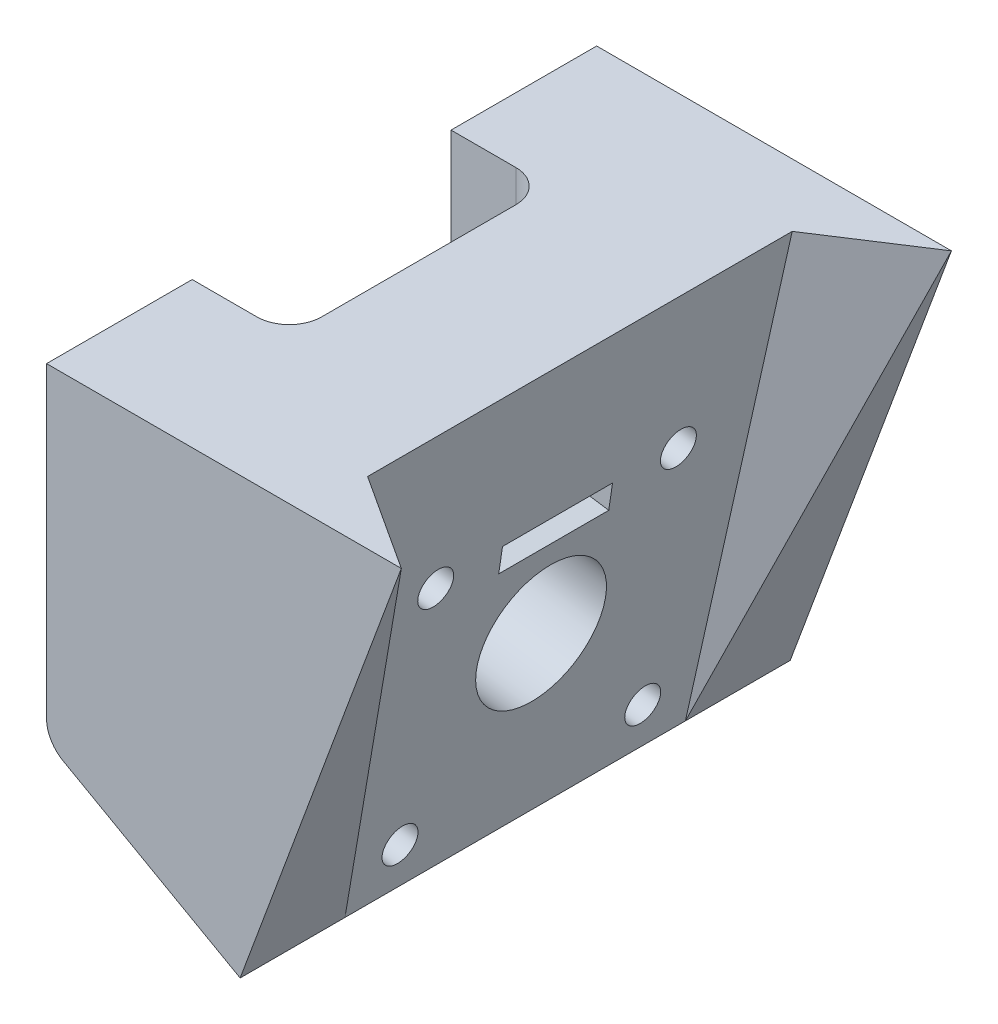
ISO-10303-21;
HEADER;
FILE_DESCRIPTION(('STEP AP214'),'2;1');
FILE_NAME('part.step','',(''),(''),'','','');
FILE_SCHEMA(('AUTOMOTIVE_DESIGN { 1 0 10303 214 1 1 1 1 }'));
ENDSEC;
DATA;
#1=APPLICATION_CONTEXT('core data for automotive mechanical design processes');
#2=APPLICATION_PROTOCOL_DEFINITION('international standard','automotive_design',2000,#1);
#3=PRODUCT_CONTEXT('',#1,'mechanical');
#4=PRODUCT('Part','Part','',(#3));
#5=PRODUCT_RELATED_PRODUCT_CATEGORY('part','',(#4));
#6=PRODUCT_DEFINITION_FORMATION('','',#4);
#7=PRODUCT_DEFINITION_CONTEXT('part definition',#1,'design');
#8=PRODUCT_DEFINITION('design','',#6,#7);
#9=PRODUCT_DEFINITION_SHAPE('','',#8);
#10=(LENGTH_UNIT() NAMED_UNIT(*) SI_UNIT(.MILLI.,.METRE.));
#11=(NAMED_UNIT(*) PLANE_ANGLE_UNIT() SI_UNIT($,.RADIAN.));
#12=(NAMED_UNIT(*) SI_UNIT($,.STERADIAN.) SOLID_ANGLE_UNIT());
#13=UNCERTAINTY_MEASURE_WITH_UNIT(LENGTH_MEASURE(1.E-05),#10,'distance_accuracy_value','');
#14=(GEOMETRIC_REPRESENTATION_CONTEXT(3) GLOBAL_UNCERTAINTY_ASSIGNED_CONTEXT((#13)) GLOBAL_UNIT_ASSIGNED_CONTEXT((#10,
#11,#12)) REPRESENTATION_CONTEXT('',''));
#15=CARTESIAN_POINT('',(0.,0.,0.));
#16=DIRECTION('',(0.,0.,1.));
#17=DIRECTION('',(1.,0.,0.));
#18=AXIS2_PLACEMENT_3D('',#15,#16,#17);
#19=CARTESIAN_POINT('',(117.270976535761,-67.4228474734763,16.9999999999979));
#20=DIRECTION('',(0.989128001977036,-0.147057117151522,0.));
#21=DIRECTION('',(0.,0.,-1.));
#22=AXIS2_PLACEMENT_3D('',#19,#20,#21);
#23=ELLIPSE('',#22,2.,1.97825600395407);
#24=DIRECTION('',(0.989128001977036,-0.147057117151522,0.));
#25=VECTOR('',#24,1.);
#26=SURFACE_OF_LINEAR_EXTRUSION('',#23,#25);
#27=CARTESIAN_POINT('',(117.620742166067,-67.4748483521984,14.9999999999979));
#28=CARTESIAN_POINT('',(117.620742166067,-67.5300800189186,14.9999977073727));
#29=CARTESIAN_POINT('',(117.620742166067,-67.5852960686657,15.0022843826991));
#30=CARTESIAN_POINT('',(117.620742166067,-67.7507481225265,15.0160337412086));
#31=CARTESIAN_POINT('',(117.620742166067,-67.8604978556769,15.0344096730208));
#32=CARTESIAN_POINT('',(117.620742166067,-68.0753802779435,15.0890653123963));
#33=CARTESIAN_POINT('',(117.620742166067,-68.1805129670598,15.1253450199597));
#34=CARTESIAN_POINT('',(117.620742166067,-68.3833407816303,15.2148056612309));
#35=CARTESIAN_POINT('',(117.620742166067,-68.4810359070844,15.2679865949387));
#36=CARTESIAN_POINT('',(117.620742166067,-68.6662728131402,15.3897833968307));
#37=CARTESIAN_POINT('',(117.620742166067,-68.7538145937419,15.4583992650149));
#38=CARTESIAN_POINT('',(117.620742166067,-68.9163359739532,15.6091732801807));
#39=CARTESIAN_POINT('',(117.620742166067,-68.9913155735629,15.6913314271623));
#40=CARTESIAN_POINT('',(117.620742166067,-69.126643029292,15.8669240033139));
#41=CARTESIAN_POINT('',(117.620742166067,-69.1869908854114,15.9603584324841));
#42=CARTESIAN_POINT('',(117.620742166067,-69.2913907864965,16.1559265147342));
#43=CARTESIAN_POINT('',(117.620742166067,-69.3354428314621,16.2580601678142));
#44=CARTESIAN_POINT('',(117.620742166067,-69.406035985642,16.4682097156529));
#45=CARTESIAN_POINT('',(117.620742166067,-69.4325770948562,16.5762256104116));
#46=CARTESIAN_POINT('',(117.620742166067,-69.4674163669998,16.7951604158238));
#47=CARTESIAN_POINT('',(117.620742166067,-69.4757145299291,16.9060793264774));
#48=CARTESIAN_POINT('',(117.620742166067,-69.4738390270468,17.1277608696691));
#49=CARTESIAN_POINT('',(117.620742166067,-69.4636653612352,17.2385235022073));
#50=CARTESIAN_POINT('',(117.620742166067,-69.4251268064956,17.4568375052808));
#51=CARTESIAN_POINT('',(117.620742166067,-69.3967619175675,17.5643888758162));
#52=CARTESIAN_POINT('',(117.620742166067,-69.3226232581912,17.7733139420283));
#53=CARTESIAN_POINT('',(117.620742166067,-69.276849487743,17.8746876377051));
#54=CARTESIAN_POINT('',(117.620742166067,-69.1691555682338,18.06846132999));
#55=CARTESIAN_POINT('',(117.620742166067,-69.1072354191728,18.1608613265981));
#56=CARTESIAN_POINT('',(117.620742166067,-68.9689565842048,18.3341391033477));
#57=CARTESIAN_POINT('',(117.620742166067,-68.8925978982978,18.4150168834893));
#58=CARTESIAN_POINT('',(117.620742166067,-68.7275480659121,18.563019508286));
#59=CARTESIAN_POINT('',(117.620742166067,-68.6388569194333,18.630144352941));
#60=CARTESIAN_POINT('',(117.620742166067,-68.4515883881759,18.7487897123842));
#61=CARTESIAN_POINT('',(117.620742166067,-68.3530110033974,18.8003102271722));
#62=CARTESIAN_POINT('',(117.620742166067,-68.1486888936954,18.8863259211112));
#63=CARTESIAN_POINT('',(117.620742166067,-68.0429441687721,18.9208211002622));
#64=CARTESIAN_POINT('',(117.620742166067,-67.8272039619101,18.9718346990368));
#65=CARTESIAN_POINT('',(117.620742166067,-67.7172084799714,18.9883531186604));
#66=CARTESIAN_POINT('',(117.620742166067,-67.4960005838601,19.0029575979327));
#67=CARTESIAN_POINT('',(117.620742166067,-67.3847881696874,19.0010436575814));
#68=CARTESIAN_POINT('',(117.620742166067,-67.1642137985331,18.9788362059782));
#69=CARTESIAN_POINT('',(117.620742166067,-67.0548518415516,18.9585426947262));
#70=CARTESIAN_POINT('',(117.620742166067,-66.8409947360819,18.9001358239234));
#71=CARTESIAN_POINT('',(117.620742166067,-66.7364995875938,18.8620224643727));
#72=CARTESIAN_POINT('',(117.620742166067,-66.5352582172261,18.7690271151919));
#73=CARTESIAN_POINT('',(117.620742166067,-66.4385119953465,18.7141451255619));
#74=CARTESIAN_POINT('',(117.620742166067,-66.2554368703883,18.5891262360346));
#75=CARTESIAN_POINT('',(117.620742166067,-66.1691079673096,18.5189893361371));
#76=CARTESIAN_POINT('',(117.620742166067,-66.0092485483546,18.3653950970291));
#77=CARTESIAN_POINT('',(117.620742166067,-65.9357180324782,18.2819377578186));
#78=CARTESIAN_POINT('',(117.620742166067,-65.8034834593923,18.1040045068489));
#79=CARTESIAN_POINT('',(117.620742166067,-65.7447794021828,18.0095285950898));
#80=CARTESIAN_POINT('',(117.620742166067,-65.6438168841618,17.8121639729725));
#81=CARTESIAN_POINT('',(117.620742166067,-65.6015584233504,17.7092752626143));
#82=CARTESIAN_POINT('',(117.620742166067,-65.5346526434757,17.4979228536995));
#83=CARTESIAN_POINT('',(117.620742166067,-65.5100053244124,17.3894591551429));
#84=CARTESIAN_POINT('',(117.620742166067,-65.4790016360317,17.1699483458289));
#85=CARTESIAN_POINT('',(117.620742166067,-65.4726452667141,17.0589012350717));
#86=CARTESIAN_POINT('',(117.620742166067,-65.4783987896626,16.8372864319267));
#87=CARTESIAN_POINT('',(117.620742166067,-65.4905086819287,16.726718739539));
#88=CARTESIAN_POINT('',(117.620742166067,-65.5328607411484,16.5091123786218));
#89=CARTESIAN_POINT('',(117.620742166067,-65.563102908102,16.4020737100924));
#90=CARTESIAN_POINT('',(117.620742166067,-65.6408853206015,16.1944776748413));
#91=CARTESIAN_POINT('',(117.620742166067,-65.6884255661473,16.0939203081196));
#92=CARTESIAN_POINT('',(117.620742166067,-65.7994931951437,15.9020603624718));
#93=CARTESIAN_POINT('',(117.620742166067,-65.8630205785943,15.8107577835457));
#94=CARTESIAN_POINT('',(117.620742166067,-66.0043092525386,15.6399257475498));
#95=CARTESIAN_POINT('',(117.620742166067,-66.0820705430322,15.56039629048));
#96=CARTESIAN_POINT('',(117.620742166067,-66.2496862225971,15.415303711664));
#97=CARTESIAN_POINT('',(117.620742166067,-66.3395406116683,15.3497405899179));
#98=CARTESIAN_POINT('',(117.620742166067,-66.5288494275008,15.2343901846421));
#99=CARTESIAN_POINT('',(117.620742166067,-66.6283038542621,15.1846029011125));
#100=CARTESIAN_POINT('',(117.620742166067,-66.8341247229826,15.102172958334));
#101=CARTESIAN_POINT('',(117.620742166067,-66.9404911649419,15.0695302990852));
#102=CARTESIAN_POINT('',(117.620742166067,-67.1187015917306,15.0306593088579));
#103=CARTESIAN_POINT('',(117.620742166067,-67.1894469998617,15.0191717566569));
#104=CARTESIAN_POINT('',(117.620742166067,-67.3317534211829,15.0038455997529));
#105=CARTESIAN_POINT('',(117.620742166067,-67.4033139851448,15.000002969336));
#106=CARTESIAN_POINT('',(117.620742166067,-67.4748483521984,14.9999999999979));
#107=B_SPLINE_CURVE_WITH_KNOTS('',3,(#27,#28,#29,#30,#31,#32,#33,#34,#35,#36,#37,#38,#39,#40,
#41,#42,#43,#44,#45,#46,#47,#48,#49,#50,#51,#52,#53,#54,#55,#56,#57,#58,#59,#60,#61,#62,#63,#64,
#65,#66,#67,#68,#69,#70,#71,#72,#73,#74,#75,#76,#77,#78,#79,#80,#81,#82,#83,#84,#85,#86,#87,#88,
#89,#90,#91,#92,#93,#94,#95,#96,#97,#98,#99,#100,#101,#102,#103,#104,#105,#106),.UNSPECIFIED.,
.T.,.F.,(4,2,2,2,2,2,2,2,2,2,2,2,2,2,2,2,2,2,2,2,2,2,2,2,2,2,2,2,2,2,2,2,2,2,2,2,2,2,2,4),(0.,
0.165644887748438,0.497797612508073,0.829950337267727,1.16210306202735,1.49425578678697,
1.82640851154659,2.15856123630621,2.49071396106583,2.82286668582546,3.15501941058508,
3.4871721353447,3.81932486010432,4.15147758486394,4.48363030962358,4.81578303438321,
5.14793575914283,5.48008848390246,5.81224120866207,6.14439393342171,6.47654665818134,
6.80869938294096,7.14085210770059,7.47300483246021,7.80515755721983,8.13731028197947,
8.46946300673909,8.8016157314987,9.13376845625833,9.46592118101795,9.79807390577758,
10.1302266305372,10.4623793552968,10.7945320800564,11.1266848048161,11.4588375295757,
11.7909902543353,12.1231429790949,12.3377942386327,12.5523324357283),.UNSPECIFIED.);
#108=CARTESIAN_POINT('',(117.620742166067,-67.4748483521984,14.9999999999979));
#109=VERTEX_POINT('',#108);
#110=EDGE_CURVE('E219',#109,#109,#107,.T.);
#111=ORIENTED_EDGE('',*,*,#110,.T.);
#112=EDGE_LOOP('',(#111));
#113=FACE_BOUND('',#112,.T.);
#114=CARTESIAN_POINT('',(120.238360541692,-67.8640188249308,16.9999999999979));
#115=DIRECTION('',(0.989128001977036,-0.147057117151522,0.));
#116=DIRECTION('',(0.,0.,-1.));
#117=AXIS2_PLACEMENT_3D('',#114,#115,#116);
#118=ELLIPSE('',#117,2.,1.97825600395407);
#119=CARTESIAN_POINT('',(120.238360541692,-67.8640188249308,14.9999999999979));
#120=VERTEX_POINT('',#119);
#121=EDGE_CURVE('E540',#120,#120,#118,.T.);
#122=ORIENTED_EDGE('',*,*,#121,.T.);
#123=EDGE_LOOP('',(#122));
#124=FACE_BOUND('',#123,.T.);
#125=ADVANCED_FACE('F44',(#113,#124),#26,.F.);
#126=CARTESIAN_POINT('',(133.548665218225,-52.4485867412738,0.));
#127=DIRECTION('',(-0.937762193643602,0.347278084786155,0.));
#128=DIRECTION('',(-0.347278084786155,-0.937762193643602,0.));
#129=AXIS2_PLACEMENT_3D('',#126,#127,#128);
#130=PLANE('',#129);
#131=DIRECTION('',(0.,0.,1.));
#132=VECTOR('',#131,1.);
#133=CARTESIAN_POINT('',(123.585184195802,-79.3531805789968,-3.60278250746475));
#134=LINE('',#133,#132);
#135=CARTESIAN_POINT('',(123.585184195802,-79.3531805789968,27.520310710116));
#136=VERTEX_POINT('',#135);
#137=CARTESIAN_POINT('',(123.585184195802,-79.3531805789968,34.));
#138=VERTEX_POINT('',#137);
#139=EDGE_CURVE('E462',#136,#138,#134,.T.);
#140=ORIENTED_EDGE('',*,*,#139,.F.);
#141=DIRECTION('',(0.338746099408536,0.914723097097162,0.220301465661212));
#142=VECTOR('',#141,1.);
#143=CARTESIAN_POINT('',(131.011372303877,-59.3000912660725,32.3498869837358));
#144=LINE('',#143,#142);
#145=CARTESIAN_POINT('',(133.548665218225,-52.4485867412738,34.));
#146=VERTEX_POINT('',#145);
#147=EDGE_CURVE('E447',#136,#146,#144,.T.);
#148=ORIENTED_EDGE('',*,*,#147,.T.);
#149=DIRECTION('',(-0.347278084786155,-0.937762193643602,0.));
#150=VECTOR('',#149,1.);
#151=CARTESIAN_POINT('',(133.548665218225,-52.4485867412738,34.));
#152=LINE('',#151,#150);
#153=EDGE_CURVE('E437',#146,#138,#152,.T.);
#154=ORIENTED_EDGE('',*,*,#153,.T.);
#155=EDGE_LOOP('',(#140,#148,#154));
#156=FACE_BOUND('',#155,.T.);
#157=ADVANCED_FACE('F237',(#156),#130,.F.);
#158=CARTESIAN_POINT('',(126.509316799064,-80.9969381931816,34.));
#159=DIRECTION('',(0.490019596809526,0.871711417123023,0.));
#160=DIRECTION('',(-0.871711417123023,0.490019596809526,0.));
#161=AXIS2_PLACEMENT_3D('',#158,#159,#160);
#162=PLANE('',#161);
#163=DIRECTION('',(0.871711417123023,-0.490019596809526,0.));
#164=VECTOR('',#163,1.);
#165=CARTESIAN_POINT('',(126.509316799064,-80.9969381931816,0.));
#166=LINE('',#165,#164);
#167=CARTESIAN_POINT('',(112.640702972448,-73.2009033792126,0.));
#168=VERTEX_POINT('',#167);
#169=CARTESIAN_POINT('',(123.585184195802,-79.3531805789968,0.));
#170=VERTEX_POINT('',#169);
#171=EDGE_CURVE('E384',#168,#170,#166,.T.);
#172=ORIENTED_EDGE('',*,*,#171,.T.);
#173=CARTESIAN_POINT('',(123.585184195802,-79.3531805789968,6.47968928988395));
#174=VERTEX_POINT('',#173);
#175=EDGE_CURVE('E458',#170,#174,#134,.T.);
#176=ORIENTED_EDGE('',*,*,#175,.T.);
#177=DIRECTION('',(0.,0.,1.));
#178=VECTOR('',#177,1.);
#179=CARTESIAN_POINT('',(123.585184195802,-79.3531805789968,6.47968928988395));
#180=LINE('',#179,#178);
#181=EDGE_CURVE('E463',#174,#136,#180,.T.);
#182=ORIENTED_EDGE('',*,*,#181,.T.);
#183=ORIENTED_EDGE('',*,*,#139,.T.);
#184=DIRECTION('',(0.871711417123023,-0.490019596809526,0.));
#185=VECTOR('',#184,1.);
#186=CARTESIAN_POINT('',(126.509316799064,-80.9969381931816,34.));
#187=LINE('',#186,#185);
#188=CARTESIAN_POINT('',(112.640702972448,-73.2009033792126,34.));
#189=VERTEX_POINT('',#188);
#190=EDGE_CURVE('E401',#189,#138,#187,.T.);
#191=ORIENTED_EDGE('',*,*,#190,.F.);
#192=DIRECTION('',(0.,0.,-1.));
#193=VECTOR('',#192,1.);
#194=CARTESIAN_POINT('',(112.640702972448,-73.2009033792126,34.));
#195=LINE('',#194,#193);
#196=CARTESIAN_POINT('',(112.640702972448,-73.2009033792126,25.));
#197=VERTEX_POINT('',#196);
#198=EDGE_CURVE('E379',#189,#197,#195,.T.);
#199=ORIENTED_EDGE('',*,*,#198,.T.);
#200=DIRECTION('',(-0.871711417123023,0.490019596809526,0.));
#201=VECTOR('',#200,1.);
#202=CARTESIAN_POINT('',(126.509316799064,-80.9969381931816,25.));
#203=LINE('',#202,#201);
#204=CARTESIAN_POINT('',(115.620742166067,-74.8760880509394,25.));
#205=VERTEX_POINT('',#204);
#206=EDGE_CURVE('E359',#205,#197,#203,.T.);
#207=ORIENTED_EDGE('',*,*,#206,.F.);
#208=CARTESIAN_POINT('',(115.620742166067,-74.8760880509394,23.));
#209=DIRECTION('',(0.490019596809526,0.871711417123023,0.));
#210=DIRECTION('',(0.871711417123023,-0.490019596809526,0.));
#211=AXIS2_PLACEMENT_3D('',#208,#209,#210);
#212=ELLIPSE('',#211,2.2943372780418,2.);
#213=CARTESIAN_POINT('',(117.620742166067,-76.0003582788705,23.));
#214=VERTEX_POINT('',#213);
#215=EDGE_CURVE('E334',#205,#214,#212,.T.);
#216=ORIENTED_EDGE('',*,*,#215,.T.);
#217=DIRECTION('',(0.,0.,1.));
#218=VECTOR('',#217,1.);
#219=CARTESIAN_POINT('',(117.620742166067,-76.0003582788705,34.));
#220=LINE('',#219,#218);
#221=CARTESIAN_POINT('',(117.620742166067,-76.0003582788705,11.));
#222=VERTEX_POINT('',#221);
#223=EDGE_CURVE('E366',#222,#214,#220,.T.);
#224=ORIENTED_EDGE('',*,*,#223,.F.);
#225=CARTESIAN_POINT('',(115.620742166067,-74.8760880509394,11.));
#226=DIRECTION('',(0.490019596809526,0.871711417123023,0.));
#227=DIRECTION('',(0.871711417123023,-0.490019596809526,0.));
#228=AXIS2_PLACEMENT_3D('',#225,#226,#227);
#229=ELLIPSE('',#228,2.2943372780418,2.);
#230=CARTESIAN_POINT('',(115.620742166067,-74.8760880509394,9.));
#231=VERTEX_POINT('',#230);
#232=EDGE_CURVE('E11',#222,#231,#229,.T.);
#233=ORIENTED_EDGE('',*,*,#232,.T.);
#234=DIRECTION('',(0.871711417123023,-0.490019596809526,0.));
#235=VECTOR('',#234,1.);
#236=CARTESIAN_POINT('',(126.509316799064,-80.9969381931816,9.));
#237=LINE('',#236,#235);
#238=CARTESIAN_POINT('',(112.640702972448,-73.2009033792126,9.));
#239=VERTEX_POINT('',#238);
#240=EDGE_CURVE('E362',#239,#231,#237,.T.);
#241=ORIENTED_EDGE('',*,*,#240,.F.);
#242=EDGE_CURVE('E383',#239,#168,#195,.T.);
#243=ORIENTED_EDGE('',*,*,#242,.T.);
#244=EDGE_LOOP('',(#172,#176,#182,#183,#191,#199,#207,#216,#224,#233,#241,#243));
#245=FACE_BOUND('',#244,.T.);
#246=ADVANCED_FACE('F310',(#245),#162,.F.);
#247=CARTESIAN_POINT('',(111.620742166067,-52.4485867412738,34.));
#248=DIRECTION('',(0.,-1.,0.));
#249=DIRECTION('',(1.,0.,0.));
#250=AXIS2_PLACEMENT_3D('',#247,#248,#249);
#251=PLANE('',#250);
#252=DIRECTION('',(0.838311850423913,0.,0.545191013717977));
#253=VECTOR('',#252,1.);
#254=CARTESIAN_POINT('',(133.548665218225,-52.4485867412738,34.));
#255=LINE('',#254,#253);
#256=CARTESIAN_POINT('',(127.585184195802,-52.4485867412738,30.1216863840602));
#257=VERTEX_POINT('',#256);
#258=EDGE_CURVE('E451',#257,#146,#255,.T.);
#259=ORIENTED_EDGE('',*,*,#258,.F.);
#260=DIRECTION('',(0.,0.,-1.));
#261=VECTOR('',#260,1.);
#262=CARTESIAN_POINT('',(127.585184195802,-52.4485867412738,58.6444243435994));
#263=LINE('',#262,#261);
#264=CARTESIAN_POINT('',(127.585184195802,-52.4485867412738,3.87831361593977));
#265=VERTEX_POINT('',#264);
#266=EDGE_CURVE('E468',#257,#265,#263,.T.);
#267=ORIENTED_EDGE('',*,*,#266,.T.);
#268=DIRECTION('',(-0.838311850423913,0.,0.545191013717977));
#269=VECTOR('',#268,1.);
#270=CARTESIAN_POINT('',(133.548665218225,-52.4485867412738,0.));
#271=LINE('',#270,#269);
#272=CARTESIAN_POINT('',(133.548665218225,-52.4485867412738,0.));
#273=VERTEX_POINT('',#272);
#274=EDGE_CURVE('E454',#273,#265,#271,.T.);
#275=ORIENTED_EDGE('',*,*,#274,.F.);
#276=DIRECTION('',(-1.,0.,0.));
#277=VECTOR('',#276,1.);
#278=CARTESIAN_POINT('',(111.620742166067,-52.4485867412738,0.));
#279=LINE('',#278,#277);
#280=CARTESIAN_POINT('',(111.620742166067,-52.4485867412738,0.));
#281=VERTEX_POINT('',#280);
#282=EDGE_CURVE('E397',#273,#281,#279,.T.);
#283=ORIENTED_EDGE('',*,*,#282,.T.);
#284=DIRECTION('',(0.,0.,-1.));
#285=VECTOR('',#284,1.);
#286=CARTESIAN_POINT('',(111.620742166067,-52.4485867412738,34.));
#287=LINE('',#286,#285);
#288=CARTESIAN_POINT('',(111.620742166067,-52.4485867412738,9.));
#289=VERTEX_POINT('',#288);
#290=EDGE_CURVE('E373',#289,#281,#287,.T.);
#291=ORIENTED_EDGE('',*,*,#290,.F.);
#292=DIRECTION('',(1.,0.,0.));
#293=VECTOR('',#292,1.);
#294=CARTESIAN_POINT('',(0.,-52.4485867412739,9.));
#295=LINE('',#294,#293);
#296=CARTESIAN_POINT('',(115.620742166067,-52.4485867412738,9.));
#297=VERTEX_POINT('',#296);
#298=EDGE_CURVE('E423',#289,#297,#295,.T.);
#299=ORIENTED_EDGE('',*,*,#298,.T.);
#300=CARTESIAN_POINT('',(115.620742166067,-52.4485867412738,11.));
#301=DIRECTION('',(0.,-1.,0.));
#302=DIRECTION('',(1.,0.,0.));
#303=AXIS2_PLACEMENT_3D('',#300,#301,#302);
#304=CIRCLE('',#303,2.);
#305=CARTESIAN_POINT('',(117.620742166067,-52.4485867412738,11.));
#306=VERTEX_POINT('',#305);
#307=EDGE_CURVE('E53',#297,#306,#304,.T.);
#308=ORIENTED_EDGE('',*,*,#307,.T.);
#309=DIRECTION('',(0.,0.,1.));
#310=VECTOR('',#309,1.);
#311=CARTESIAN_POINT('',(117.620742166067,-52.4485867412738,0.));
#312=LINE('',#311,#310);
#313=CARTESIAN_POINT('',(117.620742166067,-52.4485867412738,23.));
#314=VERTEX_POINT('',#313);
#315=EDGE_CURVE('E430',#306,#314,#312,.T.);
#316=ORIENTED_EDGE('',*,*,#315,.T.);
#317=CARTESIAN_POINT('',(115.620742166067,-52.4485867412738,23.));
#318=DIRECTION('',(0.,-1.,0.));
#319=DIRECTION('',(1.,0.,0.));
#320=AXIS2_PLACEMENT_3D('',#317,#318,#319);
#321=CIRCLE('',#320,2.);
#322=CARTESIAN_POINT('',(115.620742166067,-52.4485867412738,25.));
#323=VERTEX_POINT('',#322);
#324=EDGE_CURVE('E342',#314,#323,#321,.T.);
#325=ORIENTED_EDGE('',*,*,#324,.T.);
#326=DIRECTION('',(-1.,0.,0.));
#327=VECTOR('',#326,1.);
#328=CARTESIAN_POINT('',(0.,-52.4485867412739,25.));
#329=LINE('',#328,#327);
#330=CARTESIAN_POINT('',(111.620742166067,-52.4485867412738,25.));
#331=VERTEX_POINT('',#330);
#332=EDGE_CURVE('E434',#323,#331,#329,.T.);
#333=ORIENTED_EDGE('',*,*,#332,.T.);
#334=CARTESIAN_POINT('',(111.620742166067,-52.4485867412738,34.));
#335=VERTEX_POINT('',#334);
#336=EDGE_CURVE('E369',#335,#331,#287,.T.);
#337=ORIENTED_EDGE('',*,*,#336,.F.);
#338=DIRECTION('',(-1.,0.,0.));
#339=VECTOR('',#338,1.);
#340=CARTESIAN_POINT('',(111.620742166067,-52.4485867412738,34.));
#341=LINE('',#340,#339);
#342=EDGE_CURVE('E388',#146,#335,#341,.T.);
#343=ORIENTED_EDGE('',*,*,#342,.F.);
#344=EDGE_LOOP('',(#259,#267,#275,#283,#291,#299,#308,#316,#325,#333,#337,#343));
#345=FACE_BOUND('',#344,.T.);
#346=ADVANCED_FACE('F313',(#345),#251,.F.);
#347=CARTESIAN_POINT('',(111.620742166067,-71.4574805449665,34.));
#348=DIRECTION('',(1.,0.,0.));
#349=DIRECTION('',(0.,1.,0.));
#350=AXIS2_PLACEMENT_3D('',#347,#348,#349);
#351=PLANE('',#350);
#352=DIRECTION('',(0.,1.,0.));
#353=VECTOR('',#352,1.);
#354=CARTESIAN_POINT('',(111.620742166067,-81.2535153589356,25.));
#355=LINE('',#354,#353);
#356=CARTESIAN_POINT('',(111.620742166067,-71.4574805449665,25.));
#357=VERTEX_POINT('',#356);
#358=EDGE_CURVE('E418',#357,#331,#355,.T.);
#359=ORIENTED_EDGE('',*,*,#358,.F.);
#360=DIRECTION('',(0.,0.,-1.));
#361=VECTOR('',#360,1.);
#362=CARTESIAN_POINT('',(111.620742166067,-71.4574805449665,34.));
#363=LINE('',#362,#361);
#364=CARTESIAN_POINT('',(111.620742166067,-71.4574805449665,34.));
#365=VERTEX_POINT('',#364);
#366=EDGE_CURVE('E374',#365,#357,#363,.T.);
#367=ORIENTED_EDGE('',*,*,#366,.F.);
#368=DIRECTION('',(0.,-1.,0.));
#369=VECTOR('',#368,1.);
#370=CARTESIAN_POINT('',(111.620742166067,-71.4574805449665,34.));
#371=LINE('',#370,#369);
#372=EDGE_CURVE('E408',#335,#365,#371,.T.);
#373=ORIENTED_EDGE('',*,*,#372,.F.);
#374=ORIENTED_EDGE('',*,*,#336,.T.);
#375=EDGE_LOOP('',(#359,#367,#373,#374));
#376=FACE_BOUND('',#375,.T.);
#377=ADVANCED_FACE('F320',(#376),#351,.F.);
#378=DIRECTION('',(0.,1.,0.));
#379=VECTOR('',#378,1.);
#380=CARTESIAN_POINT('',(111.620742166067,-81.2535153589356,9.));
#381=LINE('',#380,#379);
#382=CARTESIAN_POINT('',(111.620742166067,-71.4574805449665,9.));
#383=VERTEX_POINT('',#382);
#384=EDGE_CURVE('E419',#383,#289,#381,.T.);
#385=ORIENTED_EDGE('',*,*,#384,.T.);
#386=ORIENTED_EDGE('',*,*,#290,.T.);
#387=DIRECTION('',(0.,-1.,0.));
#388=VECTOR('',#387,1.);
#389=CARTESIAN_POINT('',(111.620742166067,-71.4574805449665,0.));
#390=LINE('',#389,#388);
#391=CARTESIAN_POINT('',(111.620742166067,-71.4574805449665,0.));
#392=VERTEX_POINT('',#391);
#393=EDGE_CURVE('E393',#281,#392,#390,.T.);
#394=ORIENTED_EDGE('',*,*,#393,.T.);
#395=EDGE_CURVE('E378',#383,#392,#363,.T.);
#396=ORIENTED_EDGE('',*,*,#395,.F.);
#397=EDGE_LOOP('',(#385,#386,#394,#396));
#398=FACE_BOUND('',#397,.T.);
#399=ADVANCED_FACE('F318',(#398),#351,.F.);
#400=CARTESIAN_POINT('',(113.620742166067,-71.4574805449665,34.));
#401=DIRECTION('',(0.,0.,-1.));
#402=DIRECTION('',(-1.,0.,0.));
#403=AXIS2_PLACEMENT_3D('',#400,#401,#402);
#404=CYLINDRICAL_SURFACE('',#403,2.);
#405=CARTESIAN_POINT('',(113.620742166067,-71.4574805449665,25.));
#406=DIRECTION('',(0.,0.,-1.));
#407=DIRECTION('',(-1.,0.,0.));
#408=AXIS2_PLACEMENT_3D('',#405,#406,#407);
#409=CIRCLE('',#408,2.);
#410=EDGE_CURVE('E400',#197,#357,#409,.T.);
#411=ORIENTED_EDGE('',*,*,#410,.F.);
#412=ORIENTED_EDGE('',*,*,#198,.F.);
#413=CARTESIAN_POINT('',(113.620742166067,-71.4574805449665,34.));
#414=DIRECTION('',(0.,0.,1.));
#415=DIRECTION('',(1.,0.,0.));
#416=AXIS2_PLACEMENT_3D('',#413,#414,#415);
#417=CIRCLE('',#416,2.);
#418=EDGE_CURVE('E405',#365,#189,#417,.T.);
#419=ORIENTED_EDGE('',*,*,#418,.F.);
#420=ORIENTED_EDGE('',*,*,#366,.T.);
#421=EDGE_LOOP('',(#411,#412,#419,#420));
#422=FACE_BOUND('',#421,.T.);
#423=ADVANCED_FACE('F315',(#422),#404,.T.);
#424=CARTESIAN_POINT('',(113.620742166067,-71.4574805449665,9.));
#425=DIRECTION('',(0.,0.,1.));
#426=DIRECTION('',(1.,0.,0.));
#427=AXIS2_PLACEMENT_3D('',#424,#425,#426);
#428=CIRCLE('',#427,2.);
#429=EDGE_CURVE('E415',#383,#239,#428,.T.);
#430=ORIENTED_EDGE('',*,*,#429,.F.);
#431=ORIENTED_EDGE('',*,*,#395,.T.);
#432=CARTESIAN_POINT('',(113.620742166067,-71.4574805449665,0.));
#433=DIRECTION('',(0.,0.,1.));
#434=DIRECTION('',(1.,0.,0.));
#435=AXIS2_PLACEMENT_3D('',#432,#433,#434);
#436=CIRCLE('',#435,2.);
#437=EDGE_CURVE('E389',#392,#168,#436,.T.);
#438=ORIENTED_EDGE('',*,*,#437,.T.);
#439=ORIENTED_EDGE('',*,*,#242,.F.);
#440=EDGE_LOOP('',(#430,#431,#438,#439));
#441=FACE_BOUND('',#440,.T.);
#442=ADVANCED_FACE('F305',(#441),#404,.T.);
#443=CARTESIAN_POINT('',(127.489355992683,-79.2535153589356,34.));
#444=DIRECTION('',(0.,0.,1.));
#445=DIRECTION('',(1.,0.,0.));
#446=AXIS2_PLACEMENT_3D('',#443,#444,#445);
#447=PLANE('',#446);
#448=ORIENTED_EDGE('',*,*,#190,.T.);
#449=ORIENTED_EDGE('',*,*,#153,.F.);
#450=ORIENTED_EDGE('',*,*,#342,.T.);
#451=ORIENTED_EDGE('',*,*,#372,.T.);
#452=ORIENTED_EDGE('',*,*,#418,.T.);
#453=EDGE_LOOP('',(#448,#449,#450,#451,#452));
#454=FACE_BOUND('',#453,.T.);
#455=ADVANCED_FACE('F302',(#454),#447,.T.);
#456=CARTESIAN_POINT('',(127.489355992683,-79.2535153589356,0.));
#457=DIRECTION('',(0.,0.,1.));
#458=DIRECTION('',(1.,0.,0.));
#459=AXIS2_PLACEMENT_3D('',#456,#457,#458);
#460=PLANE('',#459);
#461=DIRECTION('',(-0.347278084786155,-0.937762193643602,0.));
#462=VECTOR('',#461,1.);
#463=CARTESIAN_POINT('',(133.548665218225,-52.4485867412738,0.));
#464=LINE('',#463,#462);
#465=EDGE_CURVE('E436',#273,#170,#464,.T.);
#466=ORIENTED_EDGE('',*,*,#465,.T.);
#467=ORIENTED_EDGE('',*,*,#171,.F.);
#468=ORIENTED_EDGE('',*,*,#437,.F.);
#469=ORIENTED_EDGE('',*,*,#393,.F.);
#470=ORIENTED_EDGE('',*,*,#282,.F.);
#471=EDGE_LOOP('',(#466,#467,#468,#469,#470));
#472=FACE_BOUND('',#471,.T.);
#473=ADVANCED_FACE('F300',(#472),#460,.F.);
#474=CARTESIAN_POINT('',(0.,-81.2535153589356,25.));
#475=DIRECTION('',(0.,0.,-1.));
#476=DIRECTION('',(-1.,0.,0.));
#477=AXIS2_PLACEMENT_3D('',#474,#475,#476);
#478=PLANE('',#477);
#479=ORIENTED_EDGE('',*,*,#332,.F.);
#480=DIRECTION('',(0.,1.,0.));
#481=VECTOR('',#480,1.);
#482=CARTESIAN_POINT('',(115.620742166067,-76.0003582788705,25.));
#483=LINE('',#482,#481);
#484=EDGE_CURVE('E335',#323,#205,#483,.F.);
#485=ORIENTED_EDGE('',*,*,#484,.T.);
#486=ORIENTED_EDGE('',*,*,#206,.T.);
#487=ORIENTED_EDGE('',*,*,#410,.T.);
#488=ORIENTED_EDGE('',*,*,#358,.T.);
#489=EDGE_LOOP('',(#479,#485,#486,#487,#488));
#490=FACE_BOUND('',#489,.T.);
#491=ADVANCED_FACE('F291',(#490),#478,.T.);
#492=CARTESIAN_POINT('',(0.,-81.2535153589356,9.));
#493=DIRECTION('',(0.,0.,1.));
#494=DIRECTION('',(1.,0.,0.));
#495=AXIS2_PLACEMENT_3D('',#492,#493,#494);
#496=PLANE('',#495);
#497=ORIENTED_EDGE('',*,*,#240,.T.);
#498=DIRECTION('',(0.,1.,0.));
#499=VECTOR('',#498,1.);
#500=CARTESIAN_POINT('',(115.620742166067,-52.4485867412738,9.));
#501=LINE('',#500,#499);
#502=EDGE_CURVE('E347',#231,#297,#501,.T.);
#503=ORIENTED_EDGE('',*,*,#502,.T.);
#504=ORIENTED_EDGE('',*,*,#298,.F.);
#505=ORIENTED_EDGE('',*,*,#384,.F.);
#506=ORIENTED_EDGE('',*,*,#429,.T.);
#507=EDGE_LOOP('',(#497,#503,#504,#505,#506));
#508=FACE_BOUND('',#507,.T.);
#509=ADVANCED_FACE('F288',(#508),#496,.T.);
#510=CARTESIAN_POINT('',(117.620742166067,-81.2535153589356,0.));
#511=DIRECTION('',(-1.,0.,0.));
#512=DIRECTION('',(0.,-1.,0.));
#513=AXIS2_PLACEMENT_3D('',#510,#511,#512);
#514=PLANE('',#513);
#515=ORIENTED_EDGE('',*,*,#110,.F.);
#516=EDGE_LOOP('',(#515));
#517=FACE_BOUND('',#516,.T.);
#518=ORIENTED_EDGE('',*,*,#223,.T.);
#519=DIRECTION('',(0.,1.,0.));
#520=VECTOR('',#519,1.);
#521=CARTESIAN_POINT('',(117.620742166067,-52.4485867412738,23.));
#522=LINE('',#521,#520);
#523=EDGE_CURVE('E337',#214,#314,#522,.T.);
#524=ORIENTED_EDGE('',*,*,#523,.T.);
#525=ORIENTED_EDGE('',*,*,#315,.F.);
#526=DIRECTION('',(0.,1.,0.));
#527=VECTOR('',#526,1.);
#528=CARTESIAN_POINT('',(117.620742166067,-76.0003582788705,11.));
#529=LINE('',#528,#527);
#530=EDGE_CURVE('E356',#306,#222,#529,.F.);
#531=ORIENTED_EDGE('',*,*,#530,.T.);
#532=EDGE_LOOP('',(#518,#524,#525,#531));
#533=FACE_BOUND('',#532,.T.);
#534=ADVANCED_FACE('F290',(#517,#533),#514,.T.);
#535=CARTESIAN_POINT('',(115.620742166067,-81.2535153589356,23.));
#536=DIRECTION('',(0.,-1.,0.));
#537=DIRECTION('',(1.,0.,0.));
#538=AXIS2_PLACEMENT_3D('',#535,#536,#537);
#539=CYLINDRICAL_SURFACE('',#538,2.);
#540=ORIENTED_EDGE('',*,*,#215,.F.);
#541=ORIENTED_EDGE('',*,*,#484,.F.);
#542=ORIENTED_EDGE('',*,*,#324,.F.);
#543=ORIENTED_EDGE('',*,*,#523,.F.);
#544=EDGE_LOOP('',(#540,#541,#542,#543));
#545=FACE_BOUND('',#544,.T.);
#546=ADVANCED_FACE('F296',(#545),#539,.F.);
#547=CARTESIAN_POINT('',(115.620742166067,-81.2535153589356,11.));
#548=DIRECTION('',(0.,-1.,0.));
#549=DIRECTION('',(1.,0.,0.));
#550=AXIS2_PLACEMENT_3D('',#547,#548,#549);
#551=CYLINDRICAL_SURFACE('',#550,2.);
#552=ORIENTED_EDGE('',*,*,#232,.F.);
#553=ORIENTED_EDGE('',*,*,#530,.F.);
#554=ORIENTED_EDGE('',*,*,#307,.F.);
#555=ORIENTED_EDGE('',*,*,#502,.F.);
#556=EDGE_LOOP('',(#552,#553,#554,#555));
#557=FACE_BOUND('',#556,.T.);
#558=ADVANCED_FACE('F46',(#557),#551,.F.);
#559=DIRECTION('',(-0.338746099408536,-0.914723097097162,0.220301465661212));
#560=VECTOR('',#559,1.);
#561=CARTESIAN_POINT('',(133.548665218225,-52.4485867412738,0.));
#562=LINE('',#561,#560);
#563=EDGE_CURVE('E441',#273,#174,#562,.T.);
#564=ORIENTED_EDGE('',*,*,#563,.T.);
#565=ORIENTED_EDGE('',*,*,#175,.F.);
#566=ORIENTED_EDGE('',*,*,#465,.F.);
#567=EDGE_LOOP('',(#564,#565,#566));
#568=FACE_BOUND('',#567,.T.);
#569=ADVANCED_FACE('F280',(#568),#130,.F.);
#570=CARTESIAN_POINT('',(133.548665218225,-78.4618544097441,34.));
#571=DIRECTION('',(-0.545191013717977,0.,0.838311850423913));
#572=DIRECTION('',(0.838311850423913,0.,0.545191013717977));
#573=AXIS2_PLACEMENT_3D('',#570,#571,#572);
#574=PLANE('',#573);
#575=ORIENTED_EDGE('',*,*,#147,.F.);
#576=DIRECTION('',(-0.146389161692311,-0.984635234394101,-0.0952033010388657));
#577=VECTOR('',#576,1.);
#578=CARTESIAN_POINT('',(132.808510095745,-17.3157212862681,33.5186446173588));
#579=LINE('',#578,#577);
#580=EDGE_CURVE('E467',#257,#136,#579,.T.);
#581=ORIENTED_EDGE('',*,*,#580,.F.);
#582=ORIENTED_EDGE('',*,*,#258,.T.);
#583=EDGE_LOOP('',(#575,#581,#582));
#584=FACE_BOUND('',#583,.T.);
#585=ADVANCED_FACE('F277',(#584),#574,.F.);
#586=CARTESIAN_POINT('',(133.548665218225,-78.4618544097441,0.));
#587=DIRECTION('',(-0.545191013717977,0.,-0.838311850423913));
#588=DIRECTION('',(-0.838311850423913,0.,0.545191013717977));
#589=AXIS2_PLACEMENT_3D('',#586,#587,#588);
#590=PLANE('',#589);
#591=ORIENTED_EDGE('',*,*,#274,.T.);
#592=DIRECTION('',(-0.146389161692311,-0.984635234394101,0.0952033010388655));
#593=VECTOR('',#592,1.);
#594=CARTESIAN_POINT('',(132.808510095745,-17.3157212862681,0.481355382641206));
#595=LINE('',#594,#593);
#596=EDGE_CURVE('E471',#265,#174,#595,.T.);
#597=ORIENTED_EDGE('',*,*,#596,.T.);
#598=ORIENTED_EDGE('',*,*,#563,.F.);
#599=EDGE_LOOP('',(#591,#597,#598));
#600=FACE_BOUND('',#599,.T.);
#601=ADVANCED_FACE('F275',(#600),#590,.F.);
#602=CARTESIAN_POINT('',(132.455135985948,-19.6925680104833,58.6444243435994));
#603=DIRECTION('',(0.989128001977036,-0.147057117151522,0.));
#604=DIRECTION('',(0.147057117151522,0.989128001977036,0.));
#605=AXIS2_PLACEMENT_3D('',#602,#603,#604);
#606=PLANE('',#605);
#607=CARTESIAN_POINT('',(125.184000551577,-68.5993044106884,16.9999999999979));
#608=DIRECTION('',(0.989128001977036,-0.147057117151522,0.));
#609=DIRECTION('',(0.147057117151522,0.989128001977036,0.));
#610=AXIS2_PLACEMENT_3D('',#607,#608,#609);
#611=CIRCLE('',#610,4.);
#612=CARTESIAN_POINT('',(125.772229020183,-64.6427924027803,16.9999999999979));
#613=VERTEX_POINT('',#612);
#614=EDGE_CURVE('E201',#613,#613,#611,.T.);
#615=ORIENTED_EDGE('',*,*,#614,.F.);
#616=EDGE_LOOP('',(#615));
#617=FACE_BOUND('',#616,.T.);
#618=DIRECTION('',(0.,0.,-1.));
#619=VECTOR('',#618,1.);
#620=CARTESIAN_POINT('',(125.967509493657,-63.3293069469688,20.4000000000001));
#621=LINE('',#620,#619);
#622=CARTESIAN_POINT('',(125.967509493657,-63.3293069469688,20.4000000000001));
#623=VERTEX_POINT('',#622);
#624=CARTESIAN_POINT('',(125.967509493657,-63.3293069469688,13.6000000000001));
#625=VERTEX_POINT('',#624);
#626=EDGE_CURVE('E60',#623,#625,#621,.T.);
#627=ORIENTED_EDGE('',*,*,#626,.F.);
#628=DIRECTION('',(-0.147057117151525,-0.989128001977036,0.));
#629=VECTOR('',#628,1.);
#630=CARTESIAN_POINT('',(126.202800881099,-61.7467021438056,20.4000000000001));
#631=LINE('',#630,#629);
#632=CARTESIAN_POINT('',(126.202800881099,-61.7467021438056,20.4000000000001));
#633=VERTEX_POINT('',#632);
#634=EDGE_CURVE('E192',#633,#623,#631,.T.);
#635=ORIENTED_EDGE('',*,*,#634,.F.);
#636=DIRECTION('',(0.,0.,1.));
#637=VECTOR('',#636,1.);
#638=CARTESIAN_POINT('',(126.202800881099,-61.7467021438056,13.6000000000001));
#639=LINE('',#638,#637);
#640=CARTESIAN_POINT('',(126.202800881099,-61.7467021438056,13.6000000000001));
#641=VERTEX_POINT('',#640);
#642=EDGE_CURVE('E198',#641,#633,#639,.T.);
#643=ORIENTED_EDGE('',*,*,#642,.F.);
#644=DIRECTION('',(0.147057117151525,0.989128001977036,0.));
#645=VECTOR('',#644,1.);
#646=CARTESIAN_POINT('',(125.967509493657,-63.3293069469688,13.6000000000001));
#647=LINE('',#646,#645);
#648=EDGE_CURVE('E209',#625,#641,#647,.T.);
#649=ORIENTED_EDGE('',*,*,#648,.F.);
#650=EDGE_LOOP('',(#627,#635,#643,#649));
#651=FACE_BOUND('',#650,.T.);
#652=CARTESIAN_POINT('',(123.967532700396,-76.7814477738566,24.4999999999997));
#653=DIRECTION('',(0.989128001977036,-0.147057117151522,0.));
#654=DIRECTION('',(0.147057117151522,0.989128001977036,0.));
#655=AXIS2_PLACEMENT_3D('',#652,#653,#654);
#656=CIRCLE('',#655,1.09999999999999);
#657=CARTESIAN_POINT('',(124.129295529263,-75.6934069716818,24.4999999999997));
#658=VERTEX_POINT('',#657);
#659=EDGE_CURVE('E486',#658,#658,#656,.T.);
#660=ORIENTED_EDGE('',*,*,#659,.F.);
#661=EDGE_LOOP('',(#660));
#662=FACE_BOUND('',#661,.T.);
#663=CARTESIAN_POINT('',(123.967532700396,-76.7814477738561,9.49999999999967));
#664=DIRECTION('',(0.989128001977036,-0.147057117151522,0.));
#665=DIRECTION('',(0.147057117151522,0.989128001977036,0.));
#666=AXIS2_PLACEMENT_3D('',#663,#664,#665);
#667=CIRCLE('',#666,1.09999999999999);
#668=CARTESIAN_POINT('',(124.129295529263,-75.6934069716814,9.49999999999967));
#669=VERTEX_POINT('',#668);
#670=EDGE_CURVE('E494',#669,#669,#667,.T.);
#671=ORIENTED_EDGE('',*,*,#670,.F.);
#672=EDGE_LOOP('',(#671));
#673=FACE_BOUND('',#672,.T.);
#674=CARTESIAN_POINT('',(126.173389457669,-61.9445277442006,9.50000000000009));
#675=DIRECTION('',(0.989128001977036,-0.147057117151522,0.));
#676=DIRECTION('',(0.147057117151522,0.989128001977036,0.));
#677=AXIS2_PLACEMENT_3D('',#674,#675,#676);
#678=CIRCLE('',#677,1.09999999999999);
#679=CARTESIAN_POINT('',(126.335152286536,-60.8564869420259,9.50000000000009));
#680=VERTEX_POINT('',#679);
#681=EDGE_CURVE('E502',#680,#680,#678,.T.);
#682=ORIENTED_EDGE('',*,*,#681,.F.);
#683=EDGE_LOOP('',(#682));
#684=FACE_BOUND('',#683,.T.);
#685=CARTESIAN_POINT('',(126.173389457669,-61.944527744201,24.5000000000001));
#686=DIRECTION('',(0.989128001977036,-0.147057117151522,0.));
#687=DIRECTION('',(0.147057117151522,0.989128001977036,0.));
#688=AXIS2_PLACEMENT_3D('',#685,#686,#687);
#689=CIRCLE('',#688,1.09999999999999);
#690=CARTESIAN_POINT('',(126.335152286536,-60.8564869420263,24.5000000000001));
#691=VERTEX_POINT('',#690);
#692=EDGE_CURVE('E478',#691,#691,#689,.T.);
#693=ORIENTED_EDGE('',*,*,#692,.F.);
#694=EDGE_LOOP('',(#693));
#695=FACE_BOUND('',#694,.T.);
#696=ORIENTED_EDGE('',*,*,#266,.F.);
#697=ORIENTED_EDGE('',*,*,#580,.T.);
#698=ORIENTED_EDGE('',*,*,#181,.F.);
#699=ORIENTED_EDGE('',*,*,#596,.F.);
#700=EDGE_LOOP('',(#696,#697,#698,#699));
#701=FACE_BOUND('',#700,.T.);
#702=ADVANCED_FACE('F271',(#617,#651,#662,#673,#684,#695,#701),#606,.T.);
#703=CARTESIAN_POINT('',(122.414703050156,-61.3857106990252,24.5000000000001));
#704=DIRECTION('',(0.989128001977036,-0.147057117151522,0.));
#705=DIRECTION('',(0.147057117151522,0.989128001977036,0.));
#706=AXIS2_PLACEMENT_3D('',#703,#704,#705);
#707=CYLINDRICAL_SURFACE('',#706,1.09999999999999);
#708=CARTESIAN_POINT('',(122.414703050156,-61.3857106990252,24.5000000000001));
#709=DIRECTION('',(0.989128001977036,-0.147057117151522,0.));
#710=DIRECTION('',(0.147057117151522,0.989128001977036,0.));
#711=AXIS2_PLACEMENT_3D('',#708,#709,#710);
#712=CIRCLE('',#711,1.09999999999999);
#713=CARTESIAN_POINT('',(122.576465879023,-60.2976698968505,24.5000000000001));
#714=VERTEX_POINT('',#713);
#715=EDGE_CURVE('E477',#714,#714,#712,.T.);
#716=ORIENTED_EDGE('',*,*,#715,.F.);
#717=EDGE_LOOP('',(#716));
#718=FACE_BOUND('',#717,.T.);
#719=ORIENTED_EDGE('',*,*,#692,.T.);
#720=EDGE_LOOP('',(#719));
#721=FACE_BOUND('',#720,.T.);
#722=ADVANCED_FACE('F267',(#718,#721),#707,.F.);
#723=CARTESIAN_POINT('',(122.414703050156,-61.3857106990252,24.5000000000001));
#724=DIRECTION('',(0.989128001977036,-0.147057117151522,0.));
#725=DIRECTION('',(0.147057117151522,0.989128001977036,0.));
#726=AXIS2_PLACEMENT_3D('',#723,#724,#725);
#727=PLANE('',#726);
#728=ORIENTED_EDGE('',*,*,#715,.T.);
#729=EDGE_LOOP('',(#728));
#730=FACE_BOUND('',#729,.T.);
#731=ADVANCED_FACE('F248',(#730),#727,.T.);
#732=CARTESIAN_POINT('',(122.414703050156,-61.3857106990248,9.50000000000009));
#733=DIRECTION('',(0.989128001977036,-0.147057117151522,0.));
#734=DIRECTION('',(0.147057117151522,0.989128001977036,0.));
#735=AXIS2_PLACEMENT_3D('',#732,#733,#734);
#736=CYLINDRICAL_SURFACE('',#735,1.09999999999999);
#737=CARTESIAN_POINT('',(122.414703050156,-61.3857106990248,9.50000000000009));
#738=DIRECTION('',(0.989128001977036,-0.147057117151522,0.));
#739=DIRECTION('',(0.147057117151522,0.989128001977036,0.));
#740=AXIS2_PLACEMENT_3D('',#737,#738,#739);
#741=CIRCLE('',#740,1.09999999999999);
#742=CARTESIAN_POINT('',(122.576465879023,-60.2976698968501,9.50000000000009));
#743=VERTEX_POINT('',#742);
#744=EDGE_CURVE('E482',#743,#743,#741,.T.);
#745=ORIENTED_EDGE('',*,*,#744,.F.);
#746=EDGE_LOOP('',(#745));
#747=FACE_BOUND('',#746,.T.);
#748=ORIENTED_EDGE('',*,*,#681,.T.);
#749=EDGE_LOOP('',(#748));
#750=FACE_BOUND('',#749,.T.);
#751=ADVANCED_FACE('F244',(#747,#750),#736,.F.);
#752=CARTESIAN_POINT('',(122.414703050156,-61.3857106990248,9.50000000000009));
#753=DIRECTION('',(0.989128001977036,-0.147057117151522,0.));
#754=DIRECTION('',(0.147057117151522,0.989128001977036,0.));
#755=AXIS2_PLACEMENT_3D('',#752,#753,#754);
#756=PLANE('',#755);
#757=ORIENTED_EDGE('',*,*,#744,.T.);
#758=EDGE_LOOP('',(#757));
#759=FACE_BOUND('',#758,.T.);
#760=ADVANCED_FACE('F240',(#759),#756,.T.);
#761=CARTESIAN_POINT('',(120.208846292883,-76.2226307286803,9.49999999999967));
#762=DIRECTION('',(0.989128001977036,-0.147057117151522,0.));
#763=DIRECTION('',(0.147057117151522,0.989128001977036,0.));
#764=AXIS2_PLACEMENT_3D('',#761,#762,#763);
#765=CYLINDRICAL_SURFACE('',#764,1.09999999999999);
#766=CARTESIAN_POINT('',(120.208846292883,-76.2226307286803,9.49999999999967));
#767=DIRECTION('',(0.989128001977036,-0.147057117151522,0.));
#768=DIRECTION('',(0.147057117151522,0.989128001977036,0.));
#769=AXIS2_PLACEMENT_3D('',#766,#767,#768);
#770=CIRCLE('',#769,1.09999999999999);
#771=CARTESIAN_POINT('',(120.37060912175,-75.1345899265056,9.49999999999967));
#772=VERTEX_POINT('',#771);
#773=EDGE_CURVE('E498',#772,#772,#770,.T.);
#774=ORIENTED_EDGE('',*,*,#773,.F.);
#775=EDGE_LOOP('',(#774));
#776=FACE_BOUND('',#775,.T.);
#777=ORIENTED_EDGE('',*,*,#670,.T.);
#778=EDGE_LOOP('',(#777));
#779=FACE_BOUND('',#778,.T.);
#780=ADVANCED_FACE('F243',(#776,#779),#765,.F.);
#781=CARTESIAN_POINT('',(120.208846292883,-76.2226307286803,9.49999999999967));
#782=DIRECTION('',(0.989128001977036,-0.147057117151522,0.));
#783=DIRECTION('',(0.147057117151522,0.989128001977036,0.));
#784=AXIS2_PLACEMENT_3D('',#781,#782,#783);
#785=PLANE('',#784);
#786=ORIENTED_EDGE('',*,*,#773,.T.);
#787=EDGE_LOOP('',(#786));
#788=FACE_BOUND('',#787,.T.);
#789=ADVANCED_FACE('F250',(#788),#785,.T.);
#790=CARTESIAN_POINT('',(120.208846292883,-76.2226307286808,24.4999999999997));
#791=DIRECTION('',(0.989128001977036,-0.147057117151522,0.));
#792=DIRECTION('',(0.147057117151522,0.989128001977036,0.));
#793=AXIS2_PLACEMENT_3D('',#790,#791,#792);
#794=CYLINDRICAL_SURFACE('',#793,1.09999999999999);
#795=CARTESIAN_POINT('',(120.208846292883,-76.2226307286808,24.4999999999997));
#796=DIRECTION('',(0.989128001977036,-0.147057117151522,0.));
#797=DIRECTION('',(0.147057117151522,0.989128001977036,0.));
#798=AXIS2_PLACEMENT_3D('',#795,#796,#797);
#799=CIRCLE('',#798,1.09999999999999);
#800=CARTESIAN_POINT('',(120.37060912175,-75.134589926506,24.4999999999997));
#801=VERTEX_POINT('',#800);
#802=EDGE_CURVE('E490',#801,#801,#799,.T.);
#803=ORIENTED_EDGE('',*,*,#802,.F.);
#804=EDGE_LOOP('',(#803));
#805=FACE_BOUND('',#804,.T.);
#806=ORIENTED_EDGE('',*,*,#659,.T.);
#807=EDGE_LOOP('',(#806));
#808=FACE_BOUND('',#807,.T.);
#809=ADVANCED_FACE('F253',(#805,#808),#794,.F.);
#810=CARTESIAN_POINT('',(120.208846292883,-76.2226307286808,24.4999999999997));
#811=DIRECTION('',(0.989128001977036,-0.147057117151522,0.));
#812=DIRECTION('',(0.147057117151522,0.989128001977036,0.));
#813=AXIS2_PLACEMENT_3D('',#810,#811,#812);
#814=PLANE('',#813);
#815=ORIENTED_EDGE('',*,*,#802,.T.);
#816=EDGE_LOOP('',(#815));
#817=FACE_BOUND('',#816,.T.);
#818=ADVANCED_FACE('F258',(#817),#814,.T.);
#819=CARTESIAN_POINT('',(123.000125487726,-62.8881355955143,20.4000000000001));
#820=DIRECTION('',(-0.147057117151522,-0.989128001977036,0.));
#821=DIRECTION('',(0.989128001977036,-0.147057117151522,0.));
#822=AXIS2_PLACEMENT_3D('',#819,#820,#821);
#823=PLANE('',#822);
#824=ORIENTED_EDGE('',*,*,#626,.T.);
#825=DIRECTION('',(0.989128001977036,-0.147057117151522,0.));
#826=VECTOR('',#825,1.);
#827=CARTESIAN_POINT('',(123.000125487726,-62.8881355955143,13.6000000000001));
#828=LINE('',#827,#826);
#829=CARTESIAN_POINT('',(123.000125487726,-62.8881355955143,13.6000000000001));
#830=VERTEX_POINT('',#829);
#831=EDGE_CURVE('E167',#830,#625,#828,.T.);
#832=ORIENTED_EDGE('',*,*,#831,.F.);
#833=DIRECTION('',(0.,0.,-1.));
#834=VECTOR('',#833,1.);
#835=CARTESIAN_POINT('',(123.000125487726,-62.8881355955143,20.4000000000001));
#836=LINE('',#835,#834);
#837=CARTESIAN_POINT('',(123.000125487726,-62.8881355955143,20.4000000000001));
#838=VERTEX_POINT('',#837);
#839=EDGE_CURVE('E171',#838,#830,#836,.T.);
#840=ORIENTED_EDGE('',*,*,#839,.F.);
#841=DIRECTION('',(0.989128001977036,-0.147057117151522,0.));
#842=VECTOR('',#841,1.);
#843=CARTESIAN_POINT('',(123.000125487726,-62.8881355955143,20.4000000000001));
#844=LINE('',#843,#842);
#845=EDGE_CURVE('E216',#838,#623,#844,.T.);
#846=ORIENTED_EDGE('',*,*,#845,.T.);
#847=EDGE_LOOP('',(#824,#832,#840,#846));
#848=FACE_BOUND('',#847,.T.);
#849=ADVANCED_FACE('F169',(#848),#823,.F.);
#850=CARTESIAN_POINT('',(123.235416875168,-61.305530792351,20.4000000000001));
#851=DIRECTION('',(0.,0.,1.));
#852=DIRECTION('',(1.,0.,0.));
#853=AXIS2_PLACEMENT_3D('',#850,#851,#852);
#854=PLANE('',#853);
#855=ORIENTED_EDGE('',*,*,#634,.T.);
#856=ORIENTED_EDGE('',*,*,#845,.F.);
#857=DIRECTION('',(-0.147057117151525,-0.989128001977036,0.));
#858=VECTOR('',#857,1.);
#859=CARTESIAN_POINT('',(123.235416875168,-61.305530792351,20.4000000000001));
#860=LINE('',#859,#858);
#861=CARTESIAN_POINT('',(123.235416875168,-61.305530792351,20.4000000000001));
#862=VERTEX_POINT('',#861);
#863=EDGE_CURVE('E178',#862,#838,#860,.T.);
#864=ORIENTED_EDGE('',*,*,#863,.F.);
#865=DIRECTION('',(0.989128001977036,-0.147057117151522,0.));
#866=VECTOR('',#865,1.);
#867=CARTESIAN_POINT('',(123.235416875168,-61.305530792351,20.4000000000001));
#868=LINE('',#867,#866);
#869=EDGE_CURVE('E220',#862,#633,#868,.T.);
#870=ORIENTED_EDGE('',*,*,#869,.T.);
#871=EDGE_LOOP('',(#855,#856,#864,#870));
#872=FACE_BOUND('',#871,.T.);
#873=ADVANCED_FACE('F570',(#872),#854,.F.);
#874=CARTESIAN_POINT('',(123.235416875168,-61.305530792351,13.6000000000001));
#875=DIRECTION('',(0.147057117151522,0.989128001977036,0.));
#876=DIRECTION('',(-0.989128001977036,0.147057117151522,0.));
#877=AXIS2_PLACEMENT_3D('',#874,#875,#876);
#878=PLANE('',#877);
#879=ORIENTED_EDGE('',*,*,#642,.T.);
#880=ORIENTED_EDGE('',*,*,#869,.F.);
#881=DIRECTION('',(0.,0.,1.));
#882=VECTOR('',#881,1.);
#883=CARTESIAN_POINT('',(123.235416875168,-61.305530792351,13.6000000000001));
#884=LINE('',#883,#882);
#885=CARTESIAN_POINT('',(123.235416875168,-61.305530792351,13.6000000000001));
#886=VERTEX_POINT('',#885);
#887=EDGE_CURVE('E187',#886,#862,#884,.T.);
#888=ORIENTED_EDGE('',*,*,#887,.F.);
#889=DIRECTION('',(0.989128001977036,-0.147057117151522,0.));
#890=VECTOR('',#889,1.);
#891=CARTESIAN_POINT('',(123.235416875168,-61.305530792351,13.6000000000001));
#892=LINE('',#891,#890);
#893=EDGE_CURVE('E177',#886,#641,#892,.T.);
#894=ORIENTED_EDGE('',*,*,#893,.T.);
#895=EDGE_LOOP('',(#879,#880,#888,#894));
#896=FACE_BOUND('',#895,.T.);
#897=ADVANCED_FACE('F573',(#896),#878,.F.);
#898=CARTESIAN_POINT('',(123.000125487726,-62.8881355955143,13.6000000000001));
#899=DIRECTION('',(0.,0.,-1.));
#900=DIRECTION('',(-1.,0.,0.));
#901=AXIS2_PLACEMENT_3D('',#898,#899,#900);
#902=PLANE('',#901);
#903=ORIENTED_EDGE('',*,*,#648,.T.);
#904=ORIENTED_EDGE('',*,*,#893,.F.);
#905=DIRECTION('',(0.147057117151525,0.989128001977036,0.));
#906=VECTOR('',#905,1.);
#907=CARTESIAN_POINT('',(123.000125487726,-62.8881355955143,13.6000000000001));
#908=LINE('',#907,#906);
#909=EDGE_CURVE('E181',#830,#886,#908,.T.);
#910=ORIENTED_EDGE('',*,*,#909,.F.);
#911=ORIENTED_EDGE('',*,*,#831,.T.);
#912=EDGE_LOOP('',(#903,#904,#910,#911));
#913=FACE_BOUND('',#912,.T.);
#914=ADVANCED_FACE('F182',(#913),#902,.F.);
#915=CARTESIAN_POINT('',(129.487751980017,-19.2513966590292,0.));
#916=DIRECTION('',(0.989128001977036,-0.147057117151525,0.));
#917=DIRECTION('',(0.147057117151525,0.989128001977036,0.));
#918=AXIS2_PLACEMENT_3D('',#915,#916,#917);
#919=PLANE('',#918);
#920=ORIENTED_EDGE('',*,*,#839,.T.);
#921=ORIENTED_EDGE('',*,*,#909,.T.);
#922=ORIENTED_EDGE('',*,*,#887,.T.);
#923=ORIENTED_EDGE('',*,*,#863,.T.);
#924=EDGE_LOOP('',(#920,#921,#922,#923));
#925=FACE_BOUND('',#924,.T.);
#926=ADVANCED_FACE('F189',(#925),#919,.T.);
#927=CARTESIAN_POINT('',(120.238360541692,-67.8640188249308,16.9999999999979));
#928=DIRECTION('',(0.989128001977036,-0.147057117151522,0.));
#929=DIRECTION('',(0.147057117151522,0.989128001977036,0.));
#930=AXIS2_PLACEMENT_3D('',#927,#928,#929);
#931=CYLINDRICAL_SURFACE('',#930,4.);
#932=CARTESIAN_POINT('',(120.238360541692,-67.8640188249308,16.9999999999979));
#933=DIRECTION('',(0.989128001977036,-0.147057117151522,0.));
#934=DIRECTION('',(0.147057117151522,0.989128001977036,0.));
#935=AXIS2_PLACEMENT_3D('',#932,#933,#934);
#936=CIRCLE('',#935,4.);
#937=CARTESIAN_POINT('',(120.826589010298,-63.9075068170227,16.9999999999979));
#938=VERTEX_POINT('',#937);
#939=EDGE_CURVE('E210',#938,#938,#936,.T.);
#940=ORIENTED_EDGE('',*,*,#939,.F.);
#941=EDGE_LOOP('',(#940));
#942=FACE_BOUND('',#941,.T.);
#943=ORIENTED_EDGE('',*,*,#614,.T.);
#944=EDGE_LOOP('',(#943));
#945=FACE_BOUND('',#944,.T.);
#946=ADVANCED_FACE('F559',(#942,#945),#931,.F.);
#947=CARTESIAN_POINT('',(120.238360541692,-67.8640188249308,16.9999999999979));
#948=DIRECTION('',(0.989128001977036,-0.147057117151522,0.));
#949=DIRECTION('',(0.147057117151522,0.989128001977036,0.));
#950=AXIS2_PLACEMENT_3D('',#947,#948,#949);
#951=PLANE('',#950);
#952=ORIENTED_EDGE('',*,*,#121,.F.);
#953=EDGE_LOOP('',(#952));
#954=FACE_BOUND('',#953,.T.);
#955=ORIENTED_EDGE('',*,*,#939,.T.);
#956=EDGE_LOOP('',(#955));
#957=FACE_BOUND('',#956,.T.);
#958=ADVANCED_FACE('F557',(#954,#957),#951,.T.);
#959=CLOSED_SHELL('',(#125,#157,#246,#346,#377,#399,#423,#442,#455,#473,#491,#509,#534,#546,
#558,#569,#585,#601,#702,#722,#731,#751,#760,#780,#789,#809,#818,#849,#873,#897,#914,#926,#946,#958));
#960=MANIFOLD_SOLID_BREP('B2',#959);
#961=ADVANCED_BREP_SHAPE_REPRESENTATION('',(#18,#960),#14);
#962=SHAPE_DEFINITION_REPRESENTATION(#9,#961);
ENDSEC;
END-ISO-10303-21;
